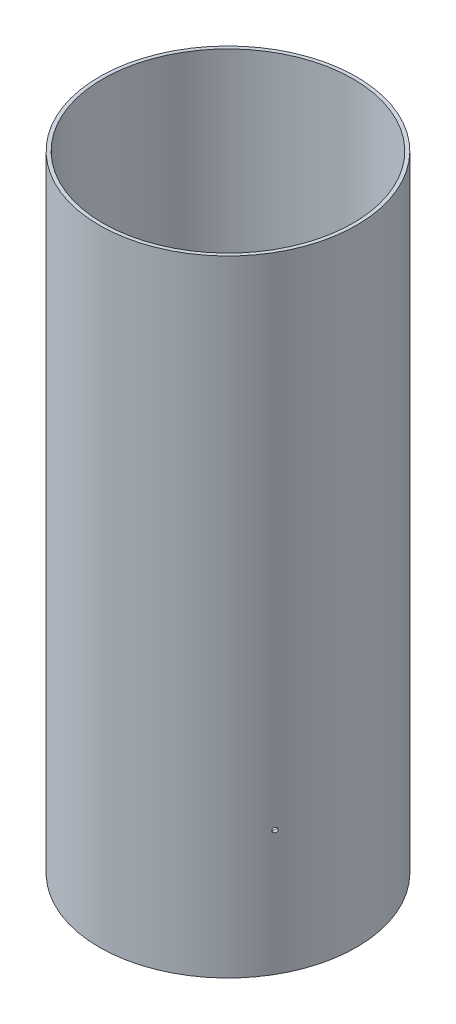
ISO-10303-21;
HEADER;
FILE_DESCRIPTION(('STEP AP214'),'2;1');
FILE_NAME('part.step','',(''),(''),'','','');
FILE_SCHEMA(('AUTOMOTIVE_DESIGN { 1 0 10303 214 1 1 1 1 }'));
ENDSEC;
DATA;
#1=APPLICATION_CONTEXT('core data for automotive mechanical design processes');
#2=APPLICATION_PROTOCOL_DEFINITION('international standard','automotive_design',2000,#1);
#3=PRODUCT_CONTEXT('',#1,'mechanical');
#4=PRODUCT('Part','Part','',(#3));
#5=PRODUCT_RELATED_PRODUCT_CATEGORY('part','',(#4));
#6=PRODUCT_DEFINITION_FORMATION('','',#4);
#7=PRODUCT_DEFINITION_CONTEXT('part definition',#1,'design');
#8=PRODUCT_DEFINITION('design','',#6,#7);
#9=PRODUCT_DEFINITION_SHAPE('','',#8);
#10=(LENGTH_UNIT() NAMED_UNIT(*) SI_UNIT(.MILLI.,.METRE.));
#11=(NAMED_UNIT(*) PLANE_ANGLE_UNIT() SI_UNIT($,.RADIAN.));
#12=(NAMED_UNIT(*) SI_UNIT($,.STERADIAN.) SOLID_ANGLE_UNIT());
#13=UNCERTAINTY_MEASURE_WITH_UNIT(LENGTH_MEASURE(1.E-05),#10,'distance_accuracy_value','');
#14=(GEOMETRIC_REPRESENTATION_CONTEXT(3) GLOBAL_UNCERTAINTY_ASSIGNED_CONTEXT((#13)) GLOBAL_UNIT_ASSIGNED_CONTEXT((#10,
#11,#12)) REPRESENTATION_CONTEXT('',''));
#15=CARTESIAN_POINT('',(0.,0.,0.));
#16=DIRECTION('',(0.,0.,1.));
#17=DIRECTION('',(1.,0.,0.));
#18=AXIS2_PLACEMENT_3D('',#15,#16,#17);
#19=CARTESIAN_POINT('',(0.,381.,0.));
#20=DIRECTION('',(0.,1.,0.));
#21=DIRECTION('',(0.,0.,1.));
#22=AXIS2_PLACEMENT_3D('',#19,#20,#21);
#23=PLANE('',#22);
#24=CARTESIAN_POINT('',(0.,381.,0.));
#25=DIRECTION('',(0.,1.,0.));
#26=DIRECTION('',(0.,0.,1.));
#27=AXIS2_PLACEMENT_3D('',#24,#25,#26);
#28=CIRCLE('',#27,78.359);
#29=CARTESIAN_POINT('',(0.,381.,78.359));
#30=VERTEX_POINT('',#29);
#31=EDGE_CURVE('E10',#30,#30,#28,.T.);
#32=ORIENTED_EDGE('',*,*,#31,.T.);
#33=EDGE_LOOP('',(#32));
#34=FACE_BOUND('',#33,.T.);
#35=CARTESIAN_POINT('',(0.,381.,0.));
#36=DIRECTION('',(0.,1.,0.));
#37=DIRECTION('',(0.,0.,1.));
#38=AXIS2_PLACEMENT_3D('',#35,#36,#37);
#39=CIRCLE('',#38,76.2);
#40=CARTESIAN_POINT('',(0.,381.,76.2));
#41=VERTEX_POINT('',#40);
#42=EDGE_CURVE('E59',#41,#41,#39,.T.);
#43=ORIENTED_EDGE('',*,*,#42,.F.);
#44=EDGE_LOOP('',(#43));
#45=FACE_BOUND('',#44,.T.);
#46=ADVANCED_FACE('F39',(#34,#45),#23,.T.);
#47=CARTESIAN_POINT('',(0.,0.,0.));
#48=DIRECTION('',(0.,1.,0.));
#49=DIRECTION('',(0.,0.,1.));
#50=AXIS2_PLACEMENT_3D('',#47,#48,#49);
#51=PLANE('',#50);
#52=CARTESIAN_POINT('',(0.,0.,0.));
#53=DIRECTION('',(0.,1.,0.));
#54=DIRECTION('',(0.,0.,1.));
#55=AXIS2_PLACEMENT_3D('',#52,#53,#54);
#56=CIRCLE('',#55,78.359);
#57=CARTESIAN_POINT('',(0.,0.,78.359));
#58=VERTEX_POINT('',#57);
#59=EDGE_CURVE('E53',#58,#58,#56,.T.);
#60=ORIENTED_EDGE('',*,*,#59,.F.);
#61=EDGE_LOOP('',(#60));
#62=FACE_BOUND('',#61,.T.);
#63=CARTESIAN_POINT('',(0.,0.,0.));
#64=DIRECTION('',(0.,1.,0.));
#65=DIRECTION('',(0.,0.,1.));
#66=AXIS2_PLACEMENT_3D('',#63,#64,#65);
#67=CIRCLE('',#66,76.2);
#68=CARTESIAN_POINT('',(0.,0.,76.2));
#69=VERTEX_POINT('',#68);
#70=EDGE_CURVE('E62',#69,#69,#67,.T.);
#71=ORIENTED_EDGE('',*,*,#70,.T.);
#72=EDGE_LOOP('',(#71));
#73=FACE_BOUND('',#72,.T.);
#74=ADVANCED_FACE('F111',(#62,#73),#51,.F.);
#75=CARTESIAN_POINT('',(0.,381.,0.));
#76=DIRECTION('',(0.,-1.,0.));
#77=DIRECTION('',(0.,0.,-1.));
#78=AXIS2_PLACEMENT_3D('',#75,#76,#77);
#79=CYLINDRICAL_SURFACE('',#78,78.359);
#80=CARTESIAN_POINT('',(-68.5559825229763,76.2,37.9501006758793));
#81=CARTESIAN_POINT('',(-68.5559809142584,76.1206807710262,37.9501038062367));
#82=CARTESIAN_POINT('',(-68.5527354930271,76.0413041920829,37.9559681968401));
#83=CARTESIAN_POINT('',(-68.5398253661749,75.8847375806855,37.9792758016436));
#84=CARTESIAN_POINT('',(-68.5301529551388,75.8075502889654,37.9967329145187));
#85=CARTESIAN_POINT('',(-68.5046386388336,75.6576531357587,38.0427135379652));
#86=CARTESIAN_POINT('',(-68.4887997061194,75.584941136498,38.0712317165556));
#87=CARTESIAN_POINT('',(-68.4513665343011,75.4460453074684,38.1384946577753));
#88=CARTESIAN_POINT('',(-68.4297737168461,75.3798598706668,38.1772368942587));
#89=CARTESIAN_POINT('',(-68.3813897559973,75.2558583597889,38.2638323892357));
#90=CARTESIAN_POINT('',(-68.354597542113,75.1980440135027,38.3116875239228));
#91=CARTESIAN_POINT('',(-68.2965237594689,75.0924400647899,38.4151172513708));
#92=CARTESIAN_POINT('',(-68.2652420135975,75.0446508580373,38.4706921486727));
#93=CARTESIAN_POINT('',(-68.19902506684,74.960454197396,38.5879565171219));
#94=CARTESIAN_POINT('',(-68.1640896855894,74.9240473057581,38.6496462901268));
#95=CARTESIAN_POINT('',(-68.0915153198866,74.8636525919106,38.7773621022485));
#96=CARTESIAN_POINT('',(-68.0538763428197,74.8396647357774,38.8433881295201));
#97=CARTESIAN_POINT('',(-67.9769370737542,74.8047914327804,38.97787712122));
#98=CARTESIAN_POINT('',(-67.937636961994,74.7939045681759,39.0463398211351));
#99=CARTESIAN_POINT('',(-67.8584731797727,74.7855379363435,39.1837566530812));
#100=CARTESIAN_POINT('',(-67.8186095107724,74.7880581343685,39.2527107838381));
#101=CARTESIAN_POINT('',(-67.7394583861383,74.8064328403161,39.3891467225576));
#102=CARTESIAN_POINT('',(-67.7001708642798,74.8222858032965,39.4566287001774));
#103=CARTESIAN_POINT('',(-67.6233030287419,74.866873650269,39.5882252596184));
#104=CARTESIAN_POINT('',(-67.5857227175707,74.8956085531867,39.6523398364922));
#105=CARTESIAN_POINT('',(-67.5133692519659,74.9651463627841,39.7754064050286));
#106=CARTESIAN_POINT('',(-67.4785962624804,75.0059499779222,39.8343580933555));
#107=CARTESIAN_POINT('',(-67.4128930674496,75.0984663878239,39.9454490658287));
#108=CARTESIAN_POINT('',(-67.3819628640808,75.1501791887661,39.9975883461167));
#109=CARTESIAN_POINT('',(-67.3248709698469,75.2630547873652,40.093612434249));
#110=CARTESIAN_POINT('',(-67.2987099582898,75.3242189289511,40.1374960662143));
#111=CARTESIAN_POINT('',(-67.2519565694794,75.454256212973,40.2157842709285));
#112=CARTESIAN_POINT('',(-67.2313641930115,75.5231293564963,40.2501888423402));
#113=CARTESIAN_POINT('',(-67.1963788321693,75.6666302924393,40.3085687769032));
#114=CARTESIAN_POINT('',(-67.181985868827,75.741258104381,40.3325441046726));
#115=CARTESIAN_POINT('',(-67.159843204619,75.8941495927531,40.3694043551382));
#116=CARTESIAN_POINT('',(-67.1520934970332,75.9724132655054,40.3822892890531));
#117=CARTESIAN_POINT('',(-67.1434778462952,76.130343018081,40.3966129167118));
#118=CARTESIAN_POINT('',(-67.1426109345925,76.2100088990034,40.3980532209497));
#119=CARTESIAN_POINT('',(-67.1477851984153,76.3684919705202,40.3894521895374));
#120=CARTESIAN_POINT('',(-67.1538263712533,76.4473091614446,40.3794108583545));
#121=CARTESIAN_POINT('',(-67.1726290868446,76.6018522524335,40.3481240232713));
#122=CARTESIAN_POINT('',(-67.1853901916219,76.6775783536154,40.326879249563));
#123=CARTESIAN_POINT('',(-67.2172387377061,76.8237958039841,40.2737712496328));
#124=CARTESIAN_POINT('',(-67.2363261830885,76.8942871497986,40.2419080165705));
#125=CARTESIAN_POINT('',(-67.2802443456756,77.0280427247158,40.1684381907336));
#126=CARTESIAN_POINT('',(-67.3050757056718,77.0913061437692,40.126830507468));
#127=CARTESIAN_POINT('',(-67.3597246660512,77.2088019025014,40.0350249154774));
#128=CARTESIAN_POINT('',(-67.3895422723124,77.2630342315337,39.9848269966257));
#129=CARTESIAN_POINT('',(-67.4532685275796,77.3609345728096,39.8772284463873));
#130=CARTESIAN_POINT('',(-67.4871776456646,77.4046013720205,39.8198269891074));
#131=CARTESIAN_POINT('',(-67.5580732071073,77.4801227750504,39.6994269442268));
#132=CARTESIAN_POINT('',(-67.5950596458831,77.5119773964566,39.6364283649599));
#133=CARTESIAN_POINT('',(-67.6710187569852,77.5629681015812,39.5066039089533));
#134=CARTESIAN_POINT('',(-67.7099913056294,77.5821049762392,39.439778270506));
#135=CARTESIAN_POINT('',(-67.7887936056756,77.6071195644399,39.3041790313729));
#136=CARTESIAN_POINT('',(-67.8286233577941,77.6129972668993,39.2354054290588));
#137=CARTESIAN_POINT('',(-67.9079954731435,77.6113265350632,39.0978686780844));
#138=CARTESIAN_POINT('',(-67.9475378767782,77.6037800264947,39.0291055293396));
#139=CARTESIAN_POINT('',(-68.0252286348464,77.5754790208319,38.8935374646934));
#140=CARTESIAN_POINT('',(-68.0633769864897,77.554724497303,38.8267325527116));
#141=CARTESIAN_POINT('',(-68.1372241475593,77.5005965645011,38.6969913950185));
#142=CARTESIAN_POINT('',(-68.1729229123715,77.4672229254692,38.6340552197704));
#143=CARTESIAN_POINT('',(-68.2408962237119,77.3888056959786,38.5138642123886));
#144=CARTESIAN_POINT('',(-68.2731709007888,77.3437625506634,38.4566091636586));
#145=CARTESIAN_POINT('',(-68.333432597072,77.2432827423469,38.3494283905518));
#146=CARTESIAN_POINT('',(-68.3614194573976,77.1878456943792,38.2995029377687));
#147=CARTESIAN_POINT('',(-68.4123695966421,77.0681342450471,38.2084192128545));
#148=CARTESIAN_POINT('',(-68.4353316269368,77.003857653584,38.1672631198956));
#149=CARTESIAN_POINT('',(-68.4756322843305,76.8682754955771,38.0949128580713));
#150=CARTESIAN_POINT('',(-68.4929678744884,76.7969661600063,38.0637240693214));
#151=CARTESIAN_POINT('',(-68.521533134158,76.649424281519,38.0122776485883));
#152=CARTESIAN_POINT('',(-68.5327701096802,76.5731977523867,37.9920069372029));
#153=CARTESIAN_POINT('',(-68.5458606843251,76.4470724692896,37.9683811083368));
#154=CARTESIAN_POINT('',(-68.5496519959642,76.3979929384828,37.9615347423546));
#155=CARTESIAN_POINT('',(-68.5547134186757,76.2992830961201,37.9523935465832));
#156=CARTESIAN_POINT('',(-68.5559835300123,76.2496527846219,37.9500987163172));
#157=CARTESIAN_POINT('',(-68.5559825229763,76.2,37.9501006758793));
#158=B_SPLINE_CURVE_WITH_KNOTS('',3,(#80,#81,#82,#83,#84,#85,#86,#87,#88,#89,#90,#91,#92,#93,
#94,#95,#96,#97,#98,#99,#100,#101,#102,#103,#104,#105,#106,#107,#108,#109,#110,#111,#112,#113,
#114,#115,#116,#117,#118,#119,#120,#121,#122,#123,#124,#125,#126,#127,#128,#129,#130,#131,#132,
#133,#134,#135,#136,#137,#138,#139,#140,#141,#142,#143,#144,#145,#146,#147,#148,#149,#150,#151,
#152,#153,#154,#155,#156,#157),.UNSPECIFIED.,.T.,.F.,(4,2,2,2,2,2,2,2,2,2,2,2,2,2,2,2,2,2,2,2,2,
2,2,2,2,2,2,2,2,2,2,2,2,2,2,2,2,2,4),(0.,0.237776452014946,0.475838493423208,0.713785919487866,
0.951674608790102,1.18961232845469,1.42755943731907,1.66551829817039,1.90347650901519,
2.14140896658914,2.37934080751348,2.61724508174066,2.85514970548912,3.09306829750582,
3.33098702427522,3.56893961297463,3.80689223523825,4.04484566476191,4.28279885357611,
4.52071855690427,4.75863816766525,4.99654227377085,5.23444653313503,5.47237742884063,
5.71030860503602,5.9482670852602,6.18622521118465,6.42416853668193,6.66211206107942,
6.90002145480954,7.13793132469255,7.37584552645823,7.6137506541159,7.8516645949772,
8.08963758830698,8.32773881772617,8.56555417376921,8.7143990925841,8.86324399580379),.UNSPECIFIED.);
#159=CARTESIAN_POINT('',(-68.5559825229763,76.2,37.9501006758793));
#160=VERTEX_POINT('',#159);
#161=EDGE_CURVE('E98',#160,#160,#158,.T.);
#162=ORIENTED_EDGE('',*,*,#161,.F.);
#163=EDGE_LOOP('',(#162));
#164=FACE_BOUND('',#163,.T.);
#165=CARTESIAN_POINT('',(67.1437425229768,76.2,40.3961721083594));
#166=CARTESIAN_POINT('',(67.1437444295868,76.1206807710263,40.3961691499902));
#167=CARTESIAN_POINT('',(67.1472004302114,76.0413041920829,40.3904263374562));
#168=CARTESIAN_POINT('',(67.1609303446466,75.8847375806855,40.3675920372344));
#169=CARTESIAN_POINT('',(67.1712124423551,75.8075502889654,40.3504869271237));
#170=CARTESIAN_POINT('',(67.1982756721891,75.6576531357587,40.30540056932));
#171=CARTESIAN_POINT('',(67.2150536729609,75.584941136498,40.2774245619254));
#172=CARTESIAN_POINT('',(67.2545885028812,75.4460453074684,40.2113750135767));
#173=CARTESIAN_POINT('',(67.2773438551477,75.3798598706668,40.1733039668797));
#174=CARTESIAN_POINT('',(67.3281457732268,75.2558583597889,40.0881044801605));
#175=CARTESIAN_POINT('',(67.3561934286252,75.1980440135027,40.0409741749695));
#176=CARTESIAN_POINT('',(67.4167293087796,75.0924400647899,39.9389659401818));
#177=CARTESIAN_POINT('',(67.44921770872,75.0446508580373,39.8840877049315));
#178=CARTESIAN_POINT('',(67.517663157377,74.960454197396,39.7681099626539));
#179=CARTESIAN_POINT('',(67.5536203773277,74.9240473057581,39.7070101484975));
#180=CARTESIAN_POINT('',(67.6279383322386,74.8636525919106,39.5803009980745));
#181=CARTESIAN_POINT('',(67.6662990606333,74.8396647357774,39.5146916741263));
#182=CARTESIAN_POINT('',(67.7443003094421,74.8047914327804,39.380815816717));
#183=CARTESIAN_POINT('',(67.7839406909001,74.7939045681759,39.3125495716036));
#184=CARTESIAN_POINT('',(67.8633652671623,74.7855379363435,39.1752833091672));
#185=CARTESIAN_POINT('',(67.9031494615935,74.7880581343685,39.1062832937464));
#186=CARTESIAN_POINT('',(67.9817308881968,74.8064328403161,38.9695184397155));
#187=CARTESIAN_POINT('',(68.0205282341839,74.8222858032965,38.9017534589243));
#188=CARTESIAN_POINT('',(68.0960602799415,74.866873650269,38.7693856808941));
#189=CARTESIAN_POINT('',(68.1327949766815,74.8956085531867,38.7047828883008));
#190=CARTESIAN_POINT('',(68.2031970185881,74.9651463627841,38.5805896647671));
#191=CARTESIAN_POINT('',(68.2368641835325,75.0059499779222,38.5209995283437));
#192=CARTESIAN_POINT('',(68.30022019031,75.0984663878239,38.4085534061006));
#193=CARTESIAN_POINT('',(68.32990902989,75.1501791887661,38.355697424095));
#194=CARTESIAN_POINT('',(68.3845223824709,75.2630547873652,38.2582423492721));
#195=CARTESIAN_POINT('',(68.4094462167847,75.3242189289511,38.2136444326923));
#196=CARTESIAN_POINT('',(68.4538690964786,75.454256212973,38.1340107079124));
#197=CARTESIAN_POINT('',(68.4733681410935,75.5231293564963,38.098974901061));
#198=CARTESIAN_POINT('',(68.5064339670752,75.6666302924393,38.0394867225297));
#199=CARTESIAN_POINT('',(68.5200007283165,75.741258104381,38.0150343867547));
#200=CARTESIAN_POINT('',(68.5408513095055,75.8941495927531,37.9774281518103));
#201=CARTESIAN_POINT('',(68.548135135809,75.9724132655054,37.9642742412117));
#202=CARTESIAN_POINT('',(68.5562319358668,76.130343018081,37.9496510549731));
#203=CARTESIAN_POINT('',(68.5570458200746,76.2100088990035,37.9481801352968));
#204=CARTESIAN_POINT('',(68.5521842402843,76.3684919705202,37.9569616949194));
#205=CARTESIAN_POINT('',(68.546508778811,76.4473091614446,37.9672141696571));
#206=CARTESIAN_POINT('',(68.5288149426206,76.6018522524335,37.999141216561));
#207=CARTESIAN_POINT('',(68.5167969812802,76.6775783536154,38.0208150443326));
#208=CARTESIAN_POINT('',(68.4867283772386,76.8237958039841,38.0749506942802));
#209=CARTESIAN_POINT('',(68.4686777306511,76.8942871497986,38.1074125234059));
#210=CARTESIAN_POINT('',(68.4270100763583,77.0280427247158,38.1821816808123));
#211=CARTESIAN_POINT('',(68.4033924456558,77.0913061437692,38.2244901110123));
#212=CARTESIAN_POINT('',(68.3512109509722,77.2088019025014,38.3177202949865));
#213=CARTESIAN_POINT('',(68.32264708116,77.2630342315337,38.3686420589147));
#214=CARTESIAN_POINT('',(68.2613271308769,77.3609345728096,38.4776298899833));
#215=CARTESIAN_POINT('',(68.2285705697007,77.4046013720205,38.5356967763048));
#216=CARTESIAN_POINT('',(68.1597488529387,77.4801227750504,38.6572941559701));
#217=CARTESIAN_POINT('',(68.1236837022791,77.5119773964566,38.7208246411789));
#218=CARTESIAN_POINT('',(68.049231980896,77.5629681015813,38.8515193890455));
#219=CARTESIAN_POINT('',(68.0108455546986,77.5821049762392,38.9186834254453));
#220=CARTESIAN_POINT('',(67.9328143188986,77.6071195644399,39.0547278387284));
#221=CARTESIAN_POINT('',(67.893169508244,77.6129972668993,39.1236082170465));
#222=CARTESIAN_POINT('',(67.8137452456209,77.6113265350632,39.2611148607785));
#223=CARTESIAN_POINT('',(67.773965813781,77.6037800264947,39.3297411612252));
#224=CARTESIAN_POINT('',(67.6954058048897,77.5754790208319,39.4648073636746));
#225=CARTESIAN_POINT('',(67.6566252298375,77.554724497303,39.5312472613011));
#226=CARTESIAN_POINT('',(67.5811896718937,77.5005965645011,39.6600713576313));
#227=CARTESIAN_POINT('',(67.5445347277178,77.4672229254692,39.7224554824664));
#228=CARTESIAN_POINT('',(67.474432917689,77.3888056959786,39.8414176005575));
#229=CARTESIAN_POINT('',(67.4409859295324,77.3437625506634,39.89799581517));
#230=CARTESIAN_POINT('',(67.3782955053662,77.2432827423469,40.0037743615798));
#231=CARTESIAN_POINT('',(67.3490522251234,77.1878456943792,40.0529744199855));
#232=CARTESIAN_POINT('',(67.2956464750986,77.0681342450471,40.1426403973546));
#233=CARTESIAN_POINT('',(67.2714852682231,77.003857653584,40.1831041453918));
#234=CARTESIAN_POINT('',(67.2289784322097,76.8682754955771,40.2541806693961));
#235=CARTESIAN_POINT('',(67.2106359439179,76.7969661600063,40.2847881252374));
#236=CARTESIAN_POINT('',(67.1803646664641,76.649424281519,40.3352495761435));
#237=CARTESIAN_POINT('',(67.1684282032126,76.5731977523867,40.3551164381002));
#238=CARTESIAN_POINT('',(67.1545129225515,76.4470724692896,40.3782661227259));
#239=CARTESIAN_POINT('',(67.1504794515069,76.3979929384828,40.38497267791));
#240=CARTESIAN_POINT('',(67.1450936551037,76.2992830961201,40.3939265964432));
#241=CARTESIAN_POINT('',(67.1437413294642,76.2496527846219,40.3961739602593));
#242=CARTESIAN_POINT('',(67.1437425229768,76.2,40.3961721083594));
#243=B_SPLINE_CURVE_WITH_KNOTS('',3,(#165,#166,#167,#168,#169,#170,#171,#172,#173,#174,#175,
#176,#177,#178,#179,#180,#181,#182,#183,#184,#185,#186,#187,#188,#189,#190,#191,#192,#193,#194,
#195,#196,#197,#198,#199,#200,#201,#202,#203,#204,#205,#206,#207,#208,#209,#210,#211,#212,#213,
#214,#215,#216,#217,#218,#219,#220,#221,#222,#223,#224,#225,#226,#227,#228,#229,#230,#231,#232,
#233,#234,#235,#236,#237,#238,#239,#240,#241,#242),.UNSPECIFIED.,.T.,.F.,(4,2,2,2,2,2,2,2,2,2,2,
2,2,2,2,2,2,2,2,2,2,2,2,2,2,2,2,2,2,2,2,2,2,2,2,2,2,2,4),(0.,0.237776452014931,
0.475838493423211,0.713785919487886,0.951674608790093,1.18961232845468,1.42755943731907,
1.66551829817038,1.9034765090152,2.14140896658915,2.37934080751349,2.61724508174066,
2.85514970548911,3.09306829750583,3.33098702427524,3.56893961297464,3.80689223523824,
4.04484566476191,4.28279885357614,4.5207185569043,4.75863816766527,4.99654227377087,
5.23444653313502,5.47237742884064,5.71030860503603,5.9482670852602,6.18622521118466,
6.42416853668194,6.66211206107943,6.90002145480956,7.13793132469256,7.37584552645823,
7.6137506541159,7.85166459497721,8.08963758830698,8.32773881772618,8.56555417376921,
8.7143990925841,8.86324399580379),.UNSPECIFIED.);
#244=CARTESIAN_POINT('',(67.1437425229768,76.2,40.3961721083594));
#245=VERTEX_POINT('',#244);
#246=EDGE_CURVE('E174',#245,#245,#243,.T.);
#247=ORIENTED_EDGE('',*,*,#246,.F.);
#248=EDGE_LOOP('',(#247));
#249=FACE_BOUND('',#248,.T.);
#250=CARTESIAN_POINT('',(1.41224,76.2,-78.3462727842391));
#251=CARTESIAN_POINT('',(1.4122364846721,76.1206807710262,-78.3462729562272));
#252=CARTESIAN_POINT('',(1.40553506281617,76.0413041920829,-78.3463945342966));
#253=CARTESIAN_POINT('',(1.37889502152884,75.8847375806855,-78.3468678388783));
#254=CARTESIAN_POINT('',(1.3589405127842,75.8075502889654,-78.3472198416428));
#255=CARTESIAN_POINT('',(1.30636296664511,75.6576531357587,-78.3481141072856));
#256=CARTESIAN_POINT('',(1.27374603315902,75.584941136498,-78.3486562784814));
#257=CARTESIAN_POINT('',(1.19677803142038,75.4460453074684,-78.3498696713524));
#258=CARTESIAN_POINT('',(1.15242986169885,75.3798598706668,-78.3505408611387));
#259=CARTESIAN_POINT('',(1.05324398277108,75.2558583597889,-78.3519368693965));
#260=CARTESIAN_POINT('',(0.99840411348835,75.1980440135027,-78.3526616988926));
#261=CARTESIAN_POINT('',(0.879794450689836,75.0924400647899,-78.3540831915529));
#262=CARTESIAN_POINT('',(0.816024304877977,75.0446508580373,-78.3547798536045));
#263=CARTESIAN_POINT('',(0.681361909463472,74.960454197396,-78.3560664797761));
#264=CARTESIAN_POINT('',(0.610469308262281,74.9240473057581,-78.3566564386247));
#265=CARTESIAN_POINT('',(0.463576987648452,74.8636525919106,-78.3576631003233));
#266=CARTESIAN_POINT('',(0.387577282186906,74.8396647357774,-78.3580798036467));
#267=CARTESIAN_POINT('',(0.23263676431267,74.8047914327804,-78.3586929379374));
#268=CARTESIAN_POINT('',(0.153696271094465,74.7939045681759,-78.3588893927391));
#269=CARTESIAN_POINT('',(-0.0048920873890906,74.7855379363435,-78.3590399622487));
#270=CARTESIAN_POINT('',(-0.0845399508206141,74.7880581343685,-78.3589940775848));
#271=CARTESIAN_POINT('',(-0.242272502057947,74.8064328403161,-78.3586651622734));
#272=CARTESIAN_POINT('',(-0.320357369903571,74.8222858032965,-78.3583821591021));
#273=CARTESIAN_POINT('',(-0.472757251199086,74.866873650269,-78.3576109405129));
#274=CARTESIAN_POINT('',(-0.54707225911026,74.8956085531867,-78.3571227247934));
#275=CARTESIAN_POINT('',(-0.68982776662171,74.9651463627841,-78.3559960697959));
#276=CARTESIAN_POINT('',(-0.758267921051495,75.0059499779222,-78.3553576216995));
#277=CARTESIAN_POINT('',(-0.887327122859849,75.0984663878239,-78.3540024719296));
#278=CARTESIAN_POINT('',(-0.947946165808666,75.1501791887661,-78.3532857702119));
#279=CARTESIAN_POINT('',(-1.05965141262347,75.2630547873652,-78.3518547835214));
#280=CARTESIAN_POINT('',(-1.1107362584943,75.3242189289511,-78.351140498907));
#281=CARTESIAN_POINT('',(-1.20191252699864,75.454256212973,-78.3497949788412));
#282=CARTESIAN_POINT('',(-1.24200394808148,75.5231293564963,-78.3491637434015));
#283=CARTESIAN_POINT('',(-1.31005513490535,75.6666302924393,-78.3480554994331));
#284=CARTESIAN_POINT('',(-1.33801485948897,75.741258104381,-78.3475784914277));
#285=CARTESIAN_POINT('',(-1.38100810488597,75.8941495927531,-78.3468325069489));
#286=CARTESIAN_POINT('',(-1.39604163877524,75.9724132655054,-78.3465635302651));
#287=CARTESIAN_POINT('',(-1.41275408957104,76.130343018081,-78.3462639716852));
#288=CARTESIAN_POINT('',(-1.41443488548159,76.2100088990034,-78.3462333562467));
#289=CARTESIAN_POINT('',(-1.40439904186839,76.3684919705202,-78.3464138844571));
#290=CARTESIAN_POINT('',(-1.39268240755717,76.4473091614446,-78.3466250280119));
#291=CARTESIAN_POINT('',(-1.35618585577544,76.6018522524335,-78.3472652398326));
#292=CARTESIAN_POINT('',(-1.33140678965779,76.6775783536154,-78.3476942938959));
#293=CARTESIAN_POINT('',(-1.26948963953197,76.8237958039841,-78.3487219439133));
#294=CARTESIAN_POINT('',(-1.2323515475621,76.8942871497986,-78.3493205399767));
#295=CARTESIAN_POINT('',(-1.14676573068212,77.0280427247158,-78.3506198715462));
#296=CARTESIAN_POINT('',(-1.09831673998345,77.0913061437692,-78.3513206184807));
#297=CARTESIAN_POINT('',(-0.991486284920472,77.2088019025014,-78.3527452104643));
#298=CARTESIAN_POINT('',(-0.933104808847124,77.2630342315337,-78.3534690555407));
#299=CARTESIAN_POINT('',(-0.808058603296765,77.3609345728096,-78.3548583363709));
#300=CARTESIAN_POINT('',(-0.741392924035593,77.4046013720205,-78.3555237654125));
#301=CARTESIAN_POINT('',(-0.601675645830825,77.4801227750504,-78.3567211001972));
#302=CARTESIAN_POINT('',(-0.528624056395463,77.5119773964566,-78.3572530061391));
#303=CARTESIAN_POINT('',(-0.378213223910174,77.5629681015812,-78.3581232979991));
#304=CARTESIAN_POINT('',(-0.300854249068617,77.5821049762392,-78.3584616959516));
#305=CARTESIAN_POINT('',(-0.144020713222447,77.6071195644399,-78.3589068701016));
#306=CARTESIAN_POINT('',(-0.0645461504494395,77.6129972668993,-78.3590136461056));
#307=CARTESIAN_POINT('',(0.0942502275231514,77.6113265350632,-78.3589835388631));
#308=CARTESIAN_POINT('',(0.173572062997681,77.6037800264947,-78.358846690565));
#309=CARTESIAN_POINT('',(0.329822829957241,77.5754790208319,-78.3583448283683));
#310=CARTESIAN_POINT('',(0.406751756652785,77.554724497303,-78.357979814013));
#311=CARTESIAN_POINT('',(0.556034475666222,77.5005965645011,-78.3570627526501));
#312=CARTESIAN_POINT('',(0.628388184654184,77.4672229254692,-78.3565107022371));
#313=CARTESIAN_POINT('',(0.766463306023472,77.3888056959786,-78.3552818129464));
#314=CARTESIAN_POINT('',(0.832184971257021,77.3437625506634,-78.3546049788289));
#315=CARTESIAN_POINT('',(0.955137091706334,77.2432827423469,-78.3532027521319));
#316=CARTESIAN_POINT('',(1.01236723227474,77.1878456943792,-78.3524773577544));
#317=CARTESIAN_POINT('',(1.11672312154399,77.0681342450471,-78.3510596102094));
#318=CARTESIAN_POINT('',(1.16384635871431,77.003857653584,-78.3503672652877));
#319=CARTESIAN_POINT('',(1.24665385212142,76.8682754955771,-78.3490935274677));
#320=CARTESIAN_POINT('',(1.28233193057102,76.7969661600063,-78.348512194559));
#321=CARTESIAN_POINT('',(1.34116846769451,76.649424281519,-78.3475272247321));
#322=CARTESIAN_POINT('',(1.36434190646816,76.5731977523867,-78.3471233753033));
#323=CARTESIAN_POINT('',(1.39134776177413,76.4470724692896,-78.3466472310629));
#324=CARTESIAN_POINT('',(1.39917254445785,76.3979929384828,-78.3465074202649));
#325=CARTESIAN_POINT('',(1.40961976357256,76.2992830961201,-78.3463201430267));
#326=CARTESIAN_POINT('',(1.41224220054861,76.2496527846219,-78.3462726765768));
#327=CARTESIAN_POINT('',(1.41224,76.2,-78.3462727842391));
#328=B_SPLINE_CURVE_WITH_KNOTS('',3,(#250,#251,#252,#253,#254,#255,#256,#257,#258,#259,#260,
#261,#262,#263,#264,#265,#266,#267,#268,#269,#270,#271,#272,#273,#274,#275,#276,#277,#278,#279,
#280,#281,#282,#283,#284,#285,#286,#287,#288,#289,#290,#291,#292,#293,#294,#295,#296,#297,#298,
#299,#300,#301,#302,#303,#304,#305,#306,#307,#308,#309,#310,#311,#312,#313,#314,#315,#316,#317,
#318,#319,#320,#321,#322,#323,#324,#325,#326,#327),.UNSPECIFIED.,.T.,.F.,(4,2,2,2,2,2,2,2,2,2,2,
2,2,2,2,2,2,2,2,2,2,2,2,2,2,2,2,2,2,2,2,2,2,2,2,2,2,2,4),(0.,0.237776452014945,0.47583849342321,
0.713785919487868,0.951674608790099,1.18961232845468,1.42755943731907,1.66551829817039,
1.9034765090152,2.14140896658914,2.37934080751348,2.61724508174065,2.85514970548911,
3.09306829750582,3.33098702427522,3.56893961297463,3.80689223523826,4.04484566476191,
4.28279885357611,4.52071855690427,4.75863816766525,4.99654227377085,5.23444653313503,
5.47237742884063,5.71030860503602,5.9482670852602,6.18622521118465,6.42416853668194,
6.66211206107943,6.90002145480955,7.13793132469255,7.37584552645823,7.6137506541159,
7.85166459497721,8.08963758830698,8.32773881772617,8.56555417376921,8.7143990925841,
8.86324399580379),.UNSPECIFIED.);
#329=CARTESIAN_POINT('',(1.41224,76.2,-78.3462727842391));
#330=VERTEX_POINT('',#329);
#331=EDGE_CURVE('E72',#330,#330,#328,.T.);
#332=ORIENTED_EDGE('',*,*,#331,.F.);
#333=EDGE_LOOP('',(#332));
#334=FACE_BOUND('',#333,.T.);
#335=ORIENTED_EDGE('',*,*,#31,.F.);
#336=EDGE_LOOP('',(#335));
#337=FACE_BOUND('',#336,.T.);
#338=ORIENTED_EDGE('',*,*,#59,.T.);
#339=EDGE_LOOP('',(#338));
#340=FACE_BOUND('',#339,.T.);
#341=ADVANCED_FACE('F41',(#164,#249,#334,#337,#340),#79,.T.);
#342=CARTESIAN_POINT('',(0.,381.,0.));
#343=DIRECTION('',(0.,-1.,0.));
#344=DIRECTION('',(0.,0.,-1.));
#345=AXIS2_PLACEMENT_3D('',#342,#343,#344);
#346=CYLINDRICAL_SURFACE('',#345,76.2);
#347=CARTESIAN_POINT('',(-66.6859213306859,76.2,36.8704203431094));
#348=CARTESIAN_POINT('',(-66.6859197262493,76.2793188317388,36.8704234757817));
#349=CARTESIAN_POINT('',(-66.6826773215966,76.3586950037378,36.8762895308057));
#350=CARTESIAN_POINT('',(-66.6697789483648,76.5152607852069,36.8996035970399));
#351=CARTESIAN_POINT('',(-66.6601152824531,76.5924476543758,36.9170655084885));
#352=CARTESIAN_POINT('',(-66.6346232119713,76.7423439603253,36.963058271231));
#353=CARTESIAN_POINT('',(-66.6187977791431,76.8150555359357,36.9915837866634));
#354=CARTESIAN_POINT('',(-66.581394861191,76.9539506017104,37.0588630761495));
#355=CARTESIAN_POINT('',(-66.5598187963692,77.0201356982748,37.0976143246084));
#356=CARTESIAN_POINT('',(-66.5114695876149,77.1441370437449,37.1842287315755));
#357=CARTESIAN_POINT('',(-66.4846953431941,77.2019515160025,37.2320938195009));
#358=CARTESIAN_POINT('',(-66.4266567984898,77.3075558078154,37.3355430739596));
#359=CARTESIAN_POINT('',(-66.3953923210157,77.3553452315859,37.3911275451069));
#360=CARTESIAN_POINT('',(-66.329207125408,77.4395425887921,37.5084098485623));
#361=CARTESIAN_POINT('',(-66.2942862124883,77.4759499154673,37.5701080065499));
#362=CARTESIAN_POINT('',(-66.2217364590409,77.5363454661954,37.697838260902));
#363=CARTESIAN_POINT('',(-66.1841076260225,77.5603337246866,37.7638703452479));
#364=CARTESIAN_POINT('',(-66.107183421935,77.5952076410001,37.8983680095976));
#365=CARTESIAN_POINT('',(-66.0678882422677,77.6060947994588,37.966833309969));
#366=CARTESIAN_POINT('',(-65.988728346631,77.6144620751453,38.1042519661899));
#367=CARTESIAN_POINT('',(-65.9488636321637,77.6119422277283,38.1732053207518));
#368=CARTESIAN_POINT('',(-65.8697048449581,77.5935683376844,38.3096359225103));
#369=CARTESIAN_POINT('',(-65.8304107028924,77.5777159290567,38.3771133495525));
#370=CARTESIAN_POINT('',(-65.7535245468458,77.5331294277273,38.5086979825359));
#371=CARTESIAN_POINT('',(-65.7159325354061,77.504395315795,38.5728051834456));
#372=CARTESIAN_POINT('',(-65.6435517820907,77.434859199939,38.6958552154645));
#373=CARTESIAN_POINT('',(-65.6087632144505,77.3940564466783,38.7547977256054));
#374=CARTESIAN_POINT('',(-65.5430268467585,77.3015418773153,38.8658693917533));
#375=CARTESIAN_POINT('',(-65.5120790490965,77.2498300544255,38.9179985435211));
#376=CARTESIAN_POINT('',(-65.4549516631646,77.1369559969629,39.0140030117837));
#377=CARTESIAN_POINT('',(-65.4287727931974,77.0757923413019,39.0578770849196));
#378=CARTESIAN_POINT('',(-65.3819856778323,76.9457558719958,39.1361474197723));
#379=CARTESIAN_POINT('',(-65.3613774332238,76.8768830572584,39.1705436801458));
#380=CARTESIAN_POINT('',(-65.326364089114,76.7333825679668,39.2289092247737));
#381=CARTESIAN_POINT('',(-65.311959011925,76.6587548727138,39.2528784715227));
#382=CARTESIAN_POINT('',(-65.2897972321754,76.5058634222229,39.2897294936163));
#383=CARTESIAN_POINT('',(-65.2820405225197,76.4275996708653,39.3026112807931));
#384=CARTESIAN_POINT('',(-65.2734167870895,76.2696702450742,39.3169318791511));
#385=CARTESIAN_POINT('',(-65.2725487362345,76.1900047809935,39.3183723928735));
#386=CARTESIAN_POINT('',(-65.2777265906625,76.0315224189261,39.3097753156985));
#387=CARTESIAN_POINT('',(-65.2837724930829,75.9527055205881,39.2997377295532));
#388=CARTESIAN_POINT('',(-65.302589919579,75.7981631822705,39.2684616378079));
#389=CARTESIAN_POINT('',(-65.315360980086,75.7224375295972,39.2472239042399));
#390=CARTESIAN_POINT('',(-65.3472334943028,75.5762207746139,39.1941325681565));
#391=CARTESIAN_POINT('',(-65.3663349523723,75.5057296759088,39.1622789583301));
#392=CARTESIAN_POINT('',(-65.4102837071203,75.3719738882435,39.0888297366144));
#393=CARTESIAN_POINT('',(-65.4351316838488,75.3087100558916,39.0472329717008));
#394=CARTESIAN_POINT('',(-65.4898144664703,75.1912132425641,38.9554495176934));
#395=CARTESIAN_POINT('',(-65.5196492784641,75.1369802726369,38.9052628180909));
#396=CARTESIAN_POINT('',(-65.5834087862927,75.0390780787528,38.7976854275661));
#397=CARTESIAN_POINT('',(-65.6173339779448,74.9954101373736,38.740293863268));
#398=CARTESIAN_POINT('',(-65.6882585481965,74.9198863856608,38.6199114839332));
#399=CARTESIAN_POINT('',(-65.7252579221425,74.8880305574463,38.5569206773726));
#400=CARTESIAN_POINT('',(-65.8012381622971,74.8370375314759,38.4271090154836));
#401=CARTESIAN_POINT('',(-65.8402188980761,74.8178994976943,38.3602884122271));
#402=CARTESIAN_POINT('',(-65.9190320081999,74.7928825692796,38.224695759719));
#403=CARTESIAN_POINT('',(-65.9588643832092,74.7870036849937,38.1559237089447));
#404=CARTESIAN_POINT('',(-66.0382355385301,74.7886720684008,38.0183870017565));
#405=CARTESIAN_POINT('',(-66.0777743624281,74.796217301169,37.949622345802));
#406=CARTESIAN_POINT('',(-66.1554524662794,74.8245155813843,37.814047856135));
#407=CARTESIAN_POINT('',(-66.1935917434324,74.8452686552576,37.7472380263341));
#408=CARTESIAN_POINT('',(-66.2674162803486,74.8993935315731,37.6174841805711));
#409=CARTESIAN_POINT('',(-66.3031014954987,74.9327655633483,37.5545402348906));
#410=CARTESIAN_POINT('',(-66.3710447885834,75.0111794586466,37.434331658164));
#411=CARTESIAN_POINT('',(-66.4033029969578,75.0562208777817,37.377066810964));
#412=CARTESIAN_POINT('',(-66.463530981417,75.156697597742,37.2698649984792));
#413=CARTESIAN_POINT('',(-66.4915005636718,75.2121333681018,37.219928364407));
#414=CARTESIAN_POINT('',(-66.5424170616763,75.3318424532319,37.1288225414209));
#415=CARTESIAN_POINT('',(-66.5653627291278,75.3961179579773,37.0876555315748));
#416=CARTESIAN_POINT('',(-66.605633548397,75.5316984536727,37.0152846965855));
#417=CARTESIAN_POINT('',(-66.6229556448609,75.6030072385503,36.9840862876478));
#418=CARTESIAN_POINT('',(-66.651498298073,75.7505483718181,36.9326230969327));
#419=CARTESIAN_POINT('',(-66.6627261547895,75.826774706671,36.912345234237));
#420=CARTESIAN_POINT('',(-66.6758067705493,75.9529043431317,36.8887095393944));
#421=CARTESIAN_POINT('',(-66.6795953660753,76.0019884113972,36.8818598987372));
#422=CARTESIAN_POINT('',(-66.6846531482321,76.100707495215,36.8727143202436));
#423=CARTESIAN_POINT('',(-66.6859223351421,76.1503425107064,36.8704183819025));
#424=CARTESIAN_POINT('',(-66.6859213306859,76.2,36.8704203431094));
#425=B_SPLINE_CURVE_WITH_KNOTS('',3,(#347,#348,#349,#350,#351,#352,#353,#354,#355,#356,#357,
#358,#359,#360,#361,#362,#363,#364,#365,#366,#367,#368,#369,#370,#371,#372,#373,#374,#375,#376,
#377,#378,#379,#380,#381,#382,#383,#384,#385,#386,#387,#388,#389,#390,#391,#392,#393,#394,#395,
#396,#397,#398,#399,#400,#401,#402,#403,#404,#405,#406,#407,#408,#409,#410,#411,#412,#413,#414,
#415,#416,#417,#418,#419,#420,#421,#422,#423,#424),.UNSPECIFIED.,.T.,.F.,(4,2,2,2,2,2,2,2,2,2,2,
2,2,2,2,2,2,2,2,2,2,2,2,2,2,2,2,2,2,2,2,2,2,2,2,2,2,2,4),(0.,0.237775243000239,
0.475836028789651,0.713782142817194,0.951669542826537,1.18960736016443,1.42755456942191,
1.66551446108561,1.90347369288102,2.14140566556905,2.3793370108131,2.61723920014653,
2.85514174463898,3.09305906350548,3.33097653040056,3.56892980318305,3.80688310968703,
4.04483727208796,4.28279118055091,4.52070967914984,4.75862807924327,4.99653008163729,
5.23443224786989,5.47236258215265,5.71029320751799,5.94825270280877,6.18621183788375,
6.42415532876732,6.66209900533856,6.90000661575673,7.1379147021793,7.37582711247664,
7.61373046404163,7.85164456479047,8.08961771342665,8.32771994019587,8.56553632388326,
8.71439533546517,8.86325433054543),.UNSPECIFIED.);
#426=CARTESIAN_POINT('',(-66.6859213306859,76.2,36.8704203431094));
#427=VERTEX_POINT('',#426);
#428=EDGE_CURVE('E43',#427,#427,#425,.T.);
#429=ORIENTED_EDGE('',*,*,#428,.F.);
#430=EDGE_LOOP('',(#429));
#431=FACE_BOUND('',#430,.T.);
#432=CARTESIAN_POINT('',(65.2736813306864,76.2,39.3164917755895));
#433=CARTESIAN_POINT('',(65.2736832414419,76.2793188317388,39.3164888197706));
#434=CARTESIAN_POINT('',(65.2771421917864,76.3586950037378,39.31074778746));
#435=CARTESIAN_POINT('',(65.2908835787947,76.5152607852069,39.2879204354566));
#436=CARTESIAN_POINT('',(65.301174204752,76.5924476543758,39.2708204995591));
#437=CARTESIAN_POINT('',(65.3282590704363,76.7423439603253,39.2257473375556));
#438=CARTESIAN_POINT('',(65.3450501750428,76.8150555359357,39.1977793529843));
#439=CARTESIAN_POINT('',(65.3846142899103,76.9539506017104,39.131747831119));
#440=CARTESIAN_POINT('',(65.4073858230932,77.0201356982748,39.0936867866401));
#441=CARTESIAN_POINT('',(65.4582214954832,77.1441370437449,39.0085079401226));
#442=CARTESIAN_POINT('',(65.4862867553706,77.2019515160025,38.9613882203243));
#443=CARTESIAN_POINT('',(65.5468571653822,77.3075558078154,38.8594007389824));
#444=CARTESIAN_POINT('',(65.5793624907147,77.3553452315859,38.8045326716801));
#445=CARTESIAN_POINT('',(65.6478393471175,77.4395425887921,38.6885734592017));
#446=CARTESIAN_POINT('',(65.6838110628417,77.4759499154673,38.6274819824961));
#447=CARTESIAN_POINT('',(65.7581538312187,77.5363454661955,38.5007869257962));
#448=CARTESIAN_POINT('',(65.7965248772179,77.5603337246866,38.4351833583146));
#449=CARTESIAN_POINT('',(65.8745411692507,77.5952076410001,38.3013162112341));
#450=CARTESIAN_POINT('',(65.9141862688165,77.6060947994588,38.2330529372102));
#451=CARTESIAN_POINT('',(65.9936143682393,77.6144620751453,38.0957891285174));
#452=CARTESIAN_POINT('',(66.0333973677324,77.6119422277283,38.0267885957932));
#453=CARTESIAN_POINT('',(66.111970341106,77.5935683376844,37.8900197742612));
#454=CARTESIAN_POINT('',(66.1507604360737,77.5777159290567,37.8222513354913));
#455=CARTESIAN_POINT('',(66.2262729929617,77.5331294277273,37.6898736546639));
#456=CARTESIAN_POINT('',(66.2629954517952,77.504395315795,37.6252644173228));
#457=CARTESIAN_POINT('',(66.3333695288023,77.434859199939,37.5010558301973));
#458=CARTESIAN_POINT('',(66.3670209561271,77.3940564466783,37.4414567917891));
#459=CARTESIAN_POINT('',(66.4303436568059,77.3015418773153,37.3289915943414));
#460=CARTESIAN_POINT('',(66.4600149276834,77.2498300544255,37.276125439491));
#461=CARTESIAN_POINT('',(66.5145935431098,77.136955996963,37.1786494378909));
#462=CARTESIAN_POINT('',(66.5395001700294,77.0757923413019,37.134040834889));
#463=CARTESIAN_POINT('',(66.5838907106919,76.9457558719959,37.0543868369867));
#464=CARTESIAN_POINT('',(66.6033746236663,76.8768830572584,37.0193414434415));
#465=CARTESIAN_POINT('',(66.6364139959649,76.7333825679668,36.959836225657));
#466=CARTESIAN_POINT('',(66.6499694339646,76.6587548727138,36.9353764394934));
#467=CARTESIAN_POINT('',(66.6708024653783,76.5058634222229,36.8977582641904));
#468=CARTESIAN_POINT('',(66.6780800654917,76.4275996708653,36.8845998629904));
#469=CARTESIAN_POINT('',(66.686170199752,76.2696702450742,36.8699711898533));
#470=CARTESIAN_POINT('',(66.6869836958027,76.1900047809935,36.8684991788999));
#471=CARTESIAN_POINT('',(66.6821273357848,76.0315224189261,36.8772818709591));
#472=CARTESIAN_POINT('',(66.6764574824005,75.9527055205881,36.8875365691166));
#473=CARTESIAN_POINT('',(66.658780305666,75.7981631822705,36.9194709843688));
#474=CARTESIAN_POINT('',(66.6467734191308,75.7224375295972,36.941149913985));
#475=CARTESIAN_POINT('',(66.6167312304701,75.5762207746139,36.995297989021));
#476=CARTESIAN_POINT('',(66.598695924193,75.5057296759088,37.0277671418717));
#477=CARTESIAN_POINT('',(66.557061409673,75.3719738882435,37.1025524908061));
#478=CARTESIAN_POINT('',(66.5334615429068,75.3087100558916,37.1448698523424));
#479=CARTESIAN_POINT('',(66.4813161314001,75.1912132425641,37.2381182582459));
#480=CARTESIAN_POINT('',(66.4527705806091,75.1369802726369,37.289049313151));
#481=CARTESIAN_POINT('',(66.3914855814561,75.0390780787528,37.3980553619257));
#482=CARTESIAN_POINT('',(66.358745624637,74.9954101373736,37.4561312218737));
#483=CARTESIAN_POINT('',(66.2899537110909,74.9198863856608,37.5777448911316));
#484=CARTESIAN_POINT('',(66.2539017593776,74.8880305574463,37.6412826921732));
#485=CARTESIAN_POINT('',(66.1794716825515,74.8370375314759,37.7719893412772));
#486=CARTESIAN_POINT('',(66.1410937105247,74.8178994976943,37.8391579503483));
#487=CARTESIAN_POINT('',(66.0630735839481,74.7928825692796,37.9752084321208));
#488=CARTESIAN_POINT('',(66.0234314284118,74.7870036849937,38.0440903061591));
#489=CARTESIAN_POINT('',(65.9440067236945,74.7886720684008,38.1815960965889));
#490=CARTESIAN_POINT('',(65.9042241967043,74.796217301169,38.2502200504975));
#491=CARTESIAN_POINT('',(65.8256522964733,74.8245155813843,38.385278506584));
#492=CARTESIAN_POINT('',(65.7868629252197,74.8452686552576,38.4517130043809));
#493=CARTESIAN_POINT('',(65.7114050670084,74.8993935315731,38.5805238516545));
#494=CARTESIAN_POINT('',(65.6747366186096,74.9327655633483,38.6429001273542));
#495=CARTESIAN_POINT('',(65.604604583954,75.0111794586466,38.7618450335457));
#496=CARTESIAN_POINT('',(65.5711408757221,75.0562208777817,38.8184138850785));
#497=CARTESIAN_POINT('',(65.5084153750082,75.156697597742,38.9241737558813));
#498=CARTESIAN_POINT('',(65.4791537724495,75.2121333681018,38.9733644416833));
#499=CARTESIAN_POINT('',(65.4257120643131,75.331842453232,39.0630123339199));
#500=CARTESIAN_POINT('',(65.4015332217143,75.3961179579773,39.1034673697628));
#501=CARTESIAN_POINT('',(65.358993649755,75.5316984536727,39.1745283397758));
#502=CARTESIAN_POINT('',(65.3406360832894,75.6030072385503,39.2051289198292));
#503=CARTESIAN_POINT('',(65.3103389793763,75.7505483718181,39.2555791779599));
#504=CARTESIAN_POINT('',(65.2983917635057,75.826774706671,39.2754417184542));
#505=CARTESIAN_POINT('',(65.2844629592157,75.9529043431317,39.2985877114207));
#506=CARTESIAN_POINT('',(65.2804252941628,76.0019884113972,39.3052935517195));
#507=CARTESIAN_POINT('',(65.2750338819334,76.100707495215,39.3142465088008));
#508=CARTESIAN_POINT('',(65.2736801344595,76.1503425107064,39.3164936260776));
#509=CARTESIAN_POINT('',(65.2736813306864,76.2,39.3164917755895));
#510=B_SPLINE_CURVE_WITH_KNOTS('',3,(#432,#433,#434,#435,#436,#437,#438,#439,#440,#441,#442,
#443,#444,#445,#446,#447,#448,#449,#450,#451,#452,#453,#454,#455,#456,#457,#458,#459,#460,#461,
#462,#463,#464,#465,#466,#467,#468,#469,#470,#471,#472,#473,#474,#475,#476,#477,#478,#479,#480,
#481,#482,#483,#484,#485,#486,#487,#488,#489,#490,#491,#492,#493,#494,#495,#496,#497,#498,#499,
#500,#501,#502,#503,#504,#505,#506,#507,#508,#509),.UNSPECIFIED.,.T.,.F.,(4,2,2,2,2,2,2,2,2,2,2,
2,2,2,2,2,2,2,2,2,2,2,2,2,2,2,2,2,2,2,2,2,2,2,2,2,2,2,4),(0.,0.237775243000239,
0.475836028789652,0.713782142817199,0.951669542826537,1.18960736016443,1.42755456942188,
1.6655144610856,1.90347369288104,2.14140566556908,2.37933701081312,2.61723920014652,
2.85514174463898,3.09305906350547,3.33097653040055,3.56892980318303,3.80688310968703,
4.04483727208797,4.28279118055092,4.52070967914985,4.75862807924328,4.9965300816373,
5.2344322478699,5.47236258215267,5.710293207518,5.94825270280879,6.18621183788375,
6.42415532876732,6.66209900533857,6.90000661575674,7.13791470217931,7.37582711247664,
7.61373046404163,7.85164456479049,8.08961771342666,8.32771994019587,8.56553632388327,
8.71439533546518,8.86325433054543),.UNSPECIFIED.);
#511=CARTESIAN_POINT('',(65.2736813306864,76.2,39.3164917755895));
#512=VERTEX_POINT('',#511);
#513=EDGE_CURVE('E73',#512,#512,#510,.T.);
#514=ORIENTED_EDGE('',*,*,#513,.F.);
#515=EDGE_LOOP('',(#514));
#516=FACE_BOUND('',#515,.T.);
#517=CARTESIAN_POINT('',(0.,77.61224,-76.2));
#518=CARTESIAN_POINT('',(-0.0793188330582737,77.6122364848091,-76.1999998232699));
#519=CARTESIAN_POINT('',(-0.158695006372178,77.6055351295966,-76.1998748226678));
#520=CARTESIAN_POINT('',(-0.315260790573147,77.5788953684229,-76.1993881871851));
#521=CARTESIAN_POINT('',(-0.392447661160091,77.5589410758405,-76.1990262683122));
#522=CARTESIAN_POINT('',(-0.542343970106896,77.5063641375865,-76.1981067907014));
#523=CARTESIAN_POINT('',(-0.615055547284691,77.4737475987435,-76.1975493262848));
#524=CARTESIAN_POINT('',(-0.753950615680383,77.3967805626084,-76.1963016721149));
#525=CARTESIAN_POINT('',(-0.820135713300501,77.3524329627001,-76.1956115151459));
#526=CARTESIAN_POINT('',(-0.944137057557806,77.2532480796414,-76.1941760087993));
#527=CARTESIAN_POINT('',(-1.00195152788642,77.1984085757468,-76.1934306477576));
#528=CARTESIAN_POINT('',(-1.10755581598199,77.0797996226656,-76.1919688456804));
#529=CARTESIAN_POINT('',(-1.15534523795827,77.0160298210749,-76.1912524057876));
#530=CARTESIAN_POINT('',(-1.23954259330446,76.881367770109,-76.1899292154231));
#531=CARTESIAN_POINT('',(-1.27594991957978,76.8104751410851,-76.1893224708029));
#532=CARTESIAN_POINT('',(-1.33634546946345,76.6635826184342,-76.1882871469083));
#533=CARTESIAN_POINT('',(-1.36033372751485,76.5875827389723,-76.1878585671396));
#534=CARTESIAN_POINT('',(-1.39520764288564,76.4326422415749,-76.1872279521312));
#535=CARTESIAN_POINT('',(-1.40609480081117,76.3537019615024,-76.187025890946));
#536=CARTESIAN_POINT('',(-1.41446207514034,76.1951139648052,-76.1868710170201));
#537=CARTESIAN_POINT('',(-1.41194222690483,76.115466250047,-76.1869182036219));
#538=CARTESIAN_POINT('',(-1.39356833558256,75.9577344931241,-76.1872564798992));
#539=CARTESIAN_POINT('',(-1.37771592731833,75.8796502604489,-76.1875475396713));
#540=CARTESIAN_POINT('',(-1.33312942823344,75.7272515560433,-76.1883407020944));
#541=CARTESIAN_POINT('',(-1.30439531817397,75.6529370899434,-76.1888428050606));
#542=CARTESIAN_POINT('',(-1.23485920615974,75.5101822646119,-76.190001482655));
#543=CARTESIAN_POINT('',(-1.194056454425,75.4417422706805,-76.19065806688));
#544=CARTESIAN_POINT('',(-1.10154188829937,75.3126832037263,-76.192051674925));
#545=CARTESIAN_POINT('',(-1.04983006712205,75.2520641355688,-76.192788698795));
#546=CARTESIAN_POINT('',(-0.936956010853012,75.1403581322114,-76.1942602295117));
#547=CARTESIAN_POINT('',(-0.87579235432892,75.0892726332906,-76.1949947359628));
#548=CARTESIAN_POINT('',(-0.74575588257909,74.9980949735737,-76.1963783181525));
#549=CARTESIAN_POINT('',(-0.676883066263686,74.9580028143312,-76.197027393879));
#550=CARTESIAN_POINT('',(-0.533382576590268,74.8899500967366,-76.1981669433234));
#551=CARTESIAN_POINT('',(-0.458754882780215,74.8619895815008,-76.1986574164777));
#552=CARTESIAN_POINT('',(-0.305863435418603,74.8189947697993,-76.1994244573707));
#553=CARTESIAN_POINT('',(-0.227599685745044,74.8039604595475,-76.1997010253375));
#554=CARTESIAN_POINT('',(-0.0696702606640959,74.7872465880439,-76.2000090484667));
#555=CARTESIAN_POINT('',(0.00999520443912631,74.7855650402686,-76.2000405400897));
#556=CARTESIAN_POINT('',(0.168477568762081,74.7955992533403,-76.1998549568208));
#557=CARTESIAN_POINT('',(0.24729446833314,74.8073150086403,-76.1996378820319));
#558=CARTESIAN_POINT('',(0.401836812415365,74.8438096120851,-76.1989796595322));
#559=CARTESIAN_POINT('',(0.477562469499678,74.8685875603559,-76.1985385272572));
#560=CARTESIAN_POINT('',(0.623779232759348,74.9305022671727,-76.1974819144077));
#561=CARTESIAN_POINT('',(0.694270335332767,74.9676390342226,-76.1968664337131));
#562=CARTESIAN_POINT('',(0.828026125520908,75.0532223074052,-76.1955304025037));
#563=CARTESIAN_POINT('',(0.891289956967616,75.101670151423,-76.1948098395634));
#564=CARTESIAN_POINT('',(1.00878676822405,75.2084983460905,-76.1933449115285));
#565=CARTESIAN_POINT('',(1.06301973698156,75.2668787088957,-76.1926005464049));
#566=CARTESIAN_POINT('',(1.16092192849861,75.391923215344,-76.1911718293648));
#567=CARTESIAN_POINT('',(1.20458986867921,75.4585883632624,-76.1904874847411));
#568=CARTESIAN_POINT('',(1.28011361828555,75.5983048456502,-76.1892560791238));
#569=CARTESIAN_POINT('',(1.31196944559205,75.6713561704521,-76.1887090179222));
#570=CARTESIAN_POINT('',(1.36296247092549,75.8217664881044,-76.1878139088115));
#571=CARTESIAN_POINT('',(1.38210050458578,75.8991251975722,-76.1874658478271));
#572=CARTESIAN_POINT('',(1.40711743219417,76.0559584377647,-76.187007943917));
#573=CARTESIAN_POINT('',(1.4129963158038,76.135432970139,-76.186898101177));
#574=CARTESIAN_POINT('',(1.41132793049305,76.2942288288865,-76.1869290232733));
#575=CARTESIAN_POINT('',(1.4037826972993,76.3735501766635,-76.1870697501114));
#576=CARTESIAN_POINT('',(1.37548441733046,76.5298001744217,-76.1875858666076));
#577=CARTESIAN_POINT('',(1.35473134412365,76.6067288196142,-76.1879612567352));
#578=CARTESIAN_POINT('',(1.30060647027686,76.7560112085441,-76.1889043793948));
#579=CARTESIAN_POINT('',(1.26723444029762,76.828364869107,-76.1894721154225));
#580=CARTESIAN_POINT('',(1.18882054950972,76.9664401916304,-76.1907358969644));
#581=CARTESIAN_POINT('',(1.14377913308575,77.0321621060036,-76.1914319375923));
#582=CARTESIAN_POINT('',(1.043302416031,77.1551155914896,-76.19287392852));
#583=CARTESIAN_POINT('',(0.987866645251148,77.212346778347,-76.1936198810764));
#584=CARTESIAN_POINT('',(0.868157558450566,77.3167049884146,-76.1950777777447));
#585=CARTESIAN_POINT('',(0.80388205245931,77.363829500353,-76.1957897133701));
#586=CARTESIAN_POINT('',(0.668301555827849,77.4466398935269,-76.1970994757966));
#587=CARTESIAN_POINT('',(0.596992771481263,77.4823195568764,-76.1976972404985));
#588=CARTESIAN_POINT('',(0.449451639353567,77.5411593149355,-76.1987100470433));
#589=CARTESIAN_POINT('',(0.373225305106909,77.5643343880299,-76.1991253073844));
#590=CARTESIAN_POINT('',(0.247095667281139,77.5913438095636,-76.199614932503));
#591=CARTESIAN_POINT('',(0.198011596939534,77.5991700708085,-76.1997587090517));
#592=CARTESIAN_POINT('',(0.0992925089584848,77.6096192660796,-76.1999512981157));
#593=CARTESIAN_POINT('',(0.0496574913800816,77.6122422006824,-76.2000001106418));
#594=CARTESIAN_POINT('',(0.,77.61224,-76.2));
#595=B_SPLINE_CURVE_WITH_KNOTS('',3,(#517,#518,#519,#520,#521,#522,#523,#524,#525,#526,#527,
#528,#529,#530,#531,#532,#533,#534,#535,#536,#537,#538,#539,#540,#541,#542,#543,#544,#545,#546,
#547,#548,#549,#550,#551,#552,#553,#554,#555,#556,#557,#558,#559,#560,#561,#562,#563,#564,#565,
#566,#567,#568,#569,#570,#571,#572,#573,#574,#575,#576,#577,#578,#579,#580,#581,#582,#583,#584,
#585,#586,#587,#588,#589,#590,#591,#592,#593,#594),.UNSPECIFIED.,.T.,.F.,(4,2,2,2,2,2,2,2,2,2,2,
2,2,2,2,2,2,2,2,2,2,2,2,2,2,2,2,2,2,2,2,2,2,2,2,2,2,2,4),(0.,0.237775246962528,
0.475836036628223,0.713782155175514,0.95166955963494,1.18960737179041,1.42755457600546,
1.6655144696082,1.90347370324913,2.14140567833269,2.37933702587307,2.61723920280945,
2.85514173505388,3.09305905040667,3.33097651376614,3.5689297916816,3.80688310323104,
4.04483726047259,4.28279116393227,4.52070966573722,4.75862806903459,4.99653008392033,
5.23443226250679,5.47236259466321,5.71029321800313,5.94825271129393,6.18621184436828,
6.42415534059085,6.66209902234362,6.90000662373362,7.13791470122907,7.37582710271773,
7.61373044553886,7.8516445516095,8.08961770544497,8.327719929888,8.56553631138092,
8.71439532921227,8.86325433055138),.UNSPECIFIED.);
#596=CARTESIAN_POINT('',(0.,77.61224,-76.2));
#597=VERTEX_POINT('',#596);
#598=EDGE_CURVE('E65',#597,#597,#595,.T.);
#599=ORIENTED_EDGE('',*,*,#598,.F.);
#600=EDGE_LOOP('',(#599));
#601=FACE_BOUND('',#600,.T.);
#602=ORIENTED_EDGE('',*,*,#42,.T.);
#603=EDGE_LOOP('',(#602));
#604=FACE_BOUND('',#603,.T.);
#605=ORIENTED_EDGE('',*,*,#70,.F.);
#606=EDGE_LOOP('',(#605));
#607=FACE_BOUND('',#606,.T.);
#608=ADVANCED_FACE('F78',(#431,#516,#601,#604,#607),#346,.F.);
#609=CARTESIAN_POINT('',(0.,76.2,-78.36));
#610=DIRECTION('',(0.,0.,1.));
#611=DIRECTION('',(1.,0.,0.));
#612=AXIS2_PLACEMENT_3D('',#609,#610,#611);
#613=CYLINDRICAL_SURFACE('',#612,1.41224);
#614=ORIENTED_EDGE('',*,*,#598,.T.);
#615=EDGE_LOOP('',(#614));
#616=FACE_BOUND('',#615,.T.);
#617=ORIENTED_EDGE('',*,*,#331,.T.);
#618=EDGE_LOOP('',(#617));
#619=FACE_BOUND('',#618,.T.);
#620=ADVANCED_FACE('F82',(#616,#619),#613,.F.);
#621=CARTESIAN_POINT('',(92.7008753202746,76.2,53.5208753202733));
#622=DIRECTION('',(-0.866025403784443,0.,-0.499999999999992));
#623=DIRECTION('',(-0.499999999999992,0.,0.866025403784443));
#624=AXIS2_PLACEMENT_3D('',#621,#622,#623);
#625=CYLINDRICAL_SURFACE('',#624,1.41224);
#626=ORIENTED_EDGE('',*,*,#513,.T.);
#627=EDGE_LOOP('',(#626));
#628=FACE_BOUND('',#627,.T.);
#629=ORIENTED_EDGE('',*,*,#246,.T.);
#630=EDGE_LOOP('',(#629));
#631=FACE_BOUND('',#630,.T.);
#632=ADVANCED_FACE('F86',(#628,#631),#625,.F.);
#633=CARTESIAN_POINT('',(-92.7008753202742,76.2,53.5208753202748));
#634=DIRECTION('',(0.866025403784436,0.,-0.500000000000004));
#635=DIRECTION('',(-0.500000000000004,0.,-0.866025403784436));
#636=AXIS2_PLACEMENT_3D('',#633,#634,#635);
#637=CYLINDRICAL_SURFACE('',#636,1.41224);
#638=ORIENTED_EDGE('',*,*,#428,.T.);
#639=EDGE_LOOP('',(#638));
#640=FACE_BOUND('',#639,.T.);
#641=ORIENTED_EDGE('',*,*,#161,.T.);
#642=EDGE_LOOP('',(#641));
#643=FACE_BOUND('',#642,.T.);
#644=ADVANCED_FACE('F152',(#640,#643),#637,.F.);
#645=CLOSED_SHELL('',(#46,#74,#341,#608,#620,#632,#644));
#646=MANIFOLD_SOLID_BREP('B2',#645);
#647=ADVANCED_BREP_SHAPE_REPRESENTATION('',(#18,#646),#14);
#648=SHAPE_DEFINITION_REPRESENTATION(#9,#647);
ENDSEC;
END-ISO-10303-21;
